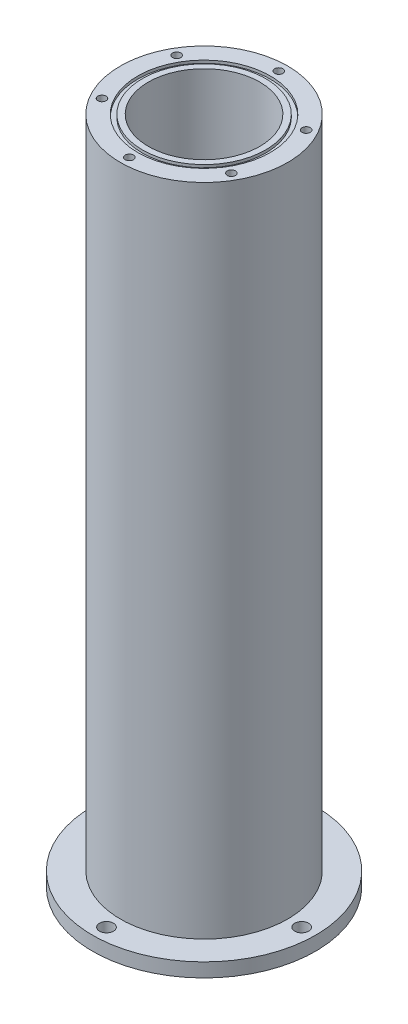
ISO-10303-21;
HEADER;
FILE_DESCRIPTION(('STEP AP214'),'2;1');
FILE_NAME('part.step','',(''),(''),'','','');
FILE_SCHEMA(('AUTOMOTIVE_DESIGN { 1 0 10303 214 1 1 1 1 }'));
ENDSEC;
DATA;
#1=APPLICATION_CONTEXT('core data for automotive mechanical design processes');
#2=APPLICATION_PROTOCOL_DEFINITION('international standard','automotive_design',2000,#1);
#3=PRODUCT_CONTEXT('',#1,'mechanical');
#4=PRODUCT('Part','Part','',(#3));
#5=PRODUCT_RELATED_PRODUCT_CATEGORY('part','',(#4));
#6=PRODUCT_DEFINITION_FORMATION('','',#4);
#7=PRODUCT_DEFINITION_CONTEXT('part definition',#1,'design');
#8=PRODUCT_DEFINITION('design','',#6,#7);
#9=PRODUCT_DEFINITION_SHAPE('','',#8);
#10=(LENGTH_UNIT() NAMED_UNIT(*) SI_UNIT(.MILLI.,.METRE.));
#11=(NAMED_UNIT(*) PLANE_ANGLE_UNIT() SI_UNIT($,.RADIAN.));
#12=(NAMED_UNIT(*) SI_UNIT($,.STERADIAN.) SOLID_ANGLE_UNIT());
#13=UNCERTAINTY_MEASURE_WITH_UNIT(LENGTH_MEASURE(1.E-05),#10,'distance_accuracy_value','');
#14=(GEOMETRIC_REPRESENTATION_CONTEXT(3) GLOBAL_UNCERTAINTY_ASSIGNED_CONTEXT((#13)) GLOBAL_UNIT_ASSIGNED_CONTEXT((#10,
#11,#12)) REPRESENTATION_CONTEXT('',''));
#15=CARTESIAN_POINT('',(0.,0.,0.));
#16=DIRECTION('',(0.,0.,1.));
#17=DIRECTION('',(1.,0.,0.));
#18=AXIS2_PLACEMENT_3D('',#15,#16,#17);
#19=CARTESIAN_POINT('',(0.,304.8,0.));
#20=DIRECTION('',(0.,1.,0.));
#21=DIRECTION('',(0.,0.,1.));
#22=AXIS2_PLACEMENT_3D('',#19,#20,#21);
#23=PLANE('',#22);
#24=CARTESIAN_POINT('',(0.,304.8,0.));
#25=DIRECTION('',(0.,1.,0.));
#26=DIRECTION('',(0.,0.,1.));
#27=AXIS2_PLACEMENT_3D('',#24,#25,#26);
#28=CIRCLE('',#27,25.4);
#29=CARTESIAN_POINT('',(0.,304.8,-25.4));
#30=VERTEX_POINT('',#29);
#31=EDGE_CURVE('E49',#30,#30,#28,.T.);
#32=ORIENTED_EDGE('',*,*,#31,.F.);
#33=EDGE_LOOP('',(#32));
#34=FACE_BOUND('',#33,.T.);
#35=CARTESIAN_POINT('',(0.,304.8,0.));
#36=DIRECTION('',(0.,1.,0.));
#37=DIRECTION('',(0.,0.,1.));
#38=AXIS2_PLACEMENT_3D('',#35,#36,#37);
#39=CIRCLE('',#38,28.1051);
#40=CARTESIAN_POINT('',(0.,304.8,28.1051));
#41=VERTEX_POINT('',#40);
#42=EDGE_CURVE('E97',#41,#41,#39,.T.);
#43=ORIENTED_EDGE('',*,*,#42,.T.);
#44=EDGE_LOOP('',(#43));
#45=FACE_BOUND('',#44,.T.);
#46=ADVANCED_FACE('F37',(#34,#45),#23,.T.);
#47=CARTESIAN_POINT('',(0.,304.8,0.));
#48=DIRECTION('',(0.,-1.,0.));
#49=DIRECTION('',(0.,0.,-1.));
#50=AXIS2_PLACEMENT_3D('',#47,#48,#49);
#51=CYLINDRICAL_SURFACE('',#50,25.4);
#52=CARTESIAN_POINT('',(0.,6.47700000000001,0.));
#53=DIRECTION('',(0.,-1.,0.));
#54=DIRECTION('',(0.,0.,-1.));
#55=AXIS2_PLACEMENT_3D('',#52,#53,#54);
#56=CIRCLE('',#55,25.4);
#57=CARTESIAN_POINT('',(0.,6.47700000000007,-25.4));
#58=VERTEX_POINT('',#57);
#59=EDGE_CURVE('E41',#58,#58,#56,.T.);
#60=CARTESIAN_POINT('',(0.,304.8,-25.4));
#61=CARTESIAN_POINT('',(0.,301.69246875,-25.4));
#62=CARTESIAN_POINT('',(0.,298.5849375,-25.4));
#63=CARTESIAN_POINT('',(0.,292.369875,-25.4));
#64=CARTESIAN_POINT('',(0.,289.26234375,-25.4));
#65=CARTESIAN_POINT('',(0.,283.04728125,-25.4));
#66=CARTESIAN_POINT('',(0.,279.93975,-25.4));
#67=CARTESIAN_POINT('',(0.,273.7246875,-25.4));
#68=CARTESIAN_POINT('',(0.,270.61715625,-25.4));
#69=CARTESIAN_POINT('',(0.,264.40209375,-25.4));
#70=CARTESIAN_POINT('',(0.,261.2945625,-25.4));
#71=CARTESIAN_POINT('',(0.,255.0795,-25.4));
#72=CARTESIAN_POINT('',(0.,251.97196875,-25.4));
#73=CARTESIAN_POINT('',(0.,245.75690625,-25.4));
#74=CARTESIAN_POINT('',(0.,242.649375,-25.4));
#75=CARTESIAN_POINT('',(0.,236.4343125,-25.4));
#76=CARTESIAN_POINT('',(0.,233.32678125,-25.4));
#77=CARTESIAN_POINT('',(0.,227.11171875,-25.4));
#78=CARTESIAN_POINT('',(0.,224.0041875,-25.4));
#79=CARTESIAN_POINT('',(0.,217.789125,-25.4));
#80=CARTESIAN_POINT('',(0.,214.68159375,-25.4));
#81=CARTESIAN_POINT('',(0.,208.46653125,-25.4));
#82=CARTESIAN_POINT('',(0.,205.359,-25.4));
#83=CARTESIAN_POINT('',(0.,199.1439375,-25.4));
#84=CARTESIAN_POINT('',(0.,196.03640625,-25.4));
#85=CARTESIAN_POINT('',(0.,189.82134375,-25.4));
#86=CARTESIAN_POINT('',(0.,186.7138125,-25.4));
#87=CARTESIAN_POINT('',(0.,180.49875,-25.4));
#88=CARTESIAN_POINT('',(0.,177.39121875,-25.4));
#89=CARTESIAN_POINT('',(0.,171.17615625,-25.4));
#90=CARTESIAN_POINT('',(0.,168.068625,-25.4));
#91=CARTESIAN_POINT('',(0.,161.8535625,-25.4));
#92=CARTESIAN_POINT('',(0.,158.74603125,-25.4));
#93=CARTESIAN_POINT('',(0.,152.53096875,-25.4));
#94=CARTESIAN_POINT('',(0.,149.4234375,-25.4));
#95=CARTESIAN_POINT('',(0.,143.208375,-25.4));
#96=CARTESIAN_POINT('',(0.,140.10084375,-25.4));
#97=CARTESIAN_POINT('',(0.,133.88578125,-25.4));
#98=CARTESIAN_POINT('',(0.,130.77825,-25.4));
#99=CARTESIAN_POINT('',(0.,124.5631875,-25.4));
#100=CARTESIAN_POINT('',(0.,121.45565625,-25.4));
#101=CARTESIAN_POINT('',(0.,115.24059375,-25.4));
#102=CARTESIAN_POINT('',(0.,112.1330625,-25.4));
#103=CARTESIAN_POINT('',(0.,105.918,-25.4));
#104=CARTESIAN_POINT('',(0.,102.81046875,-25.4));
#105=CARTESIAN_POINT('',(0.,96.5954062500001,-25.4));
#106=CARTESIAN_POINT('',(0.,93.4878750000001,-25.4));
#107=CARTESIAN_POINT('',(0.,87.2728125000001,-25.4));
#108=CARTESIAN_POINT('',(0.,84.16528125,-25.4));
#109=CARTESIAN_POINT('',(0.,77.95021875,-25.4));
#110=CARTESIAN_POINT('',(0.,74.8426875,-25.4));
#111=CARTESIAN_POINT('',(0.,68.627625,-25.4));
#112=CARTESIAN_POINT('',(0.,65.52009375,-25.4));
#113=CARTESIAN_POINT('',(0.,59.30503125,-25.4));
#114=CARTESIAN_POINT('',(0.,56.1975,-25.4));
#115=CARTESIAN_POINT('',(0.,49.9824375000001,-25.4));
#116=CARTESIAN_POINT('',(0.,46.8749062500001,-25.4));
#117=CARTESIAN_POINT('',(0.,40.6598437500001,-25.4));
#118=CARTESIAN_POINT('',(0.,37.5523125000001,-25.4));
#119=CARTESIAN_POINT('',(0.,31.3372500000001,-25.4));
#120=CARTESIAN_POINT('',(0.,28.2297187500001,-25.4));
#121=CARTESIAN_POINT('',(0.,22.0146562500001,-25.4));
#122=CARTESIAN_POINT('',(0.,18.9071250000001,-25.4));
#123=CARTESIAN_POINT('',(0.,12.6920625000001,-25.4));
#124=CARTESIAN_POINT('',(0.,9.58453125000006,-25.4));
#125=CARTESIAN_POINT('',(0.,6.47700000000007,-25.4));
#126=B_SPLINE_CURVE_WITH_KNOTS('',3,(#60,#61,#62,#63,#64,#65,#66,#67,#68,#69,#70,#71,#72,#73,
#74,#75,#76,#77,#78,#79,#80,#81,#82,#83,#84,#85,#86,#87,#88,#89,#90,#91,#92,#93,#94,#95,#96,#97,
#98,#99,#100,#101,#102,#103,#104,#105,#106,#107,#108,#109,#110,#111,#112,#113,#114,#115,#116,
#117,#118,#119,#120,#121,#122,#123,#124,#125),.UNSPECIFIED.,.F.,.F.,(4,2,2,2,2,2,2,2,2,2,2,2,2,
2,2,2,2,2,2,2,2,2,2,2,2,2,2,2,2,2,2,2,4),(0.,9.32259375,18.6451875,27.96778125,37.290375,
46.61296875,55.9355625,65.2581562499999,74.58075,83.9033437499999,93.2259374999999,102.54853125,
111.871125,121.19371875,130.5163125,139.83890625,149.1615,158.48409375,167.8066875,177.12928125,
186.451875,195.77446875,205.0970625,214.41965625,223.74225,233.06484375,242.3874375,
251.71003125,261.032625,270.35521875,279.6778125,289.00040625,298.323),.UNSPECIFIED.);
#127=EDGE_CURVE('BSEAM162',#30,#58,#126,.T.);
#128=ORIENTED_EDGE('',*,*,#31,.T.);
#129=ORIENTED_EDGE('',*,*,#59,.T.);
#130=ORIENTED_EDGE('',*,*,#127,.T.);
#131=ORIENTED_EDGE('',*,*,#127,.F.);
#132=EDGE_LOOP('',(#128,#130,#129,#131));
#133=FACE_BOUND('',#132,.T.);
#134=ADVANCED_FACE('F162',(#133),#51,.F.);
#135=CARTESIAN_POINT('',(0.,304.8,0.));
#136=DIRECTION('',(0.,-1.,0.));
#137=DIRECTION('',(0.,0.,-1.));
#138=AXIS2_PLACEMENT_3D('',#135,#136,#137);
#139=CYLINDRICAL_SURFACE('',#138,38.1);
#140=CARTESIAN_POINT('',(0.,304.8,0.));
#141=DIRECTION('',(0.,1.,0.));
#142=DIRECTION('',(0.,0.,1.));
#143=AXIS2_PLACEMENT_3D('',#140,#141,#142);
#144=CIRCLE('',#143,38.1);
#145=CARTESIAN_POINT('',(0.,304.8,-38.1));
#146=VERTEX_POINT('',#145);
#147=EDGE_CURVE('E45',#146,#146,#144,.T.);
#148=CARTESIAN_POINT('',(0.,6.35000000000002,0.));
#149=DIRECTION('',(0.,-1.,0.));
#150=DIRECTION('',(0.,0.,-1.));
#151=AXIS2_PLACEMENT_3D('',#148,#149,#150);
#152=CIRCLE('',#151,38.1);
#153=CARTESIAN_POINT('',(0.,6.35000000000008,-38.1));
#154=VERTEX_POINT('',#153);
#155=EDGE_CURVE('E10',#154,#154,#152,.T.);
#156=CARTESIAN_POINT('',(0.,304.8,-38.1));
#157=CARTESIAN_POINT('',(0.,301.691145833333,-38.1));
#158=CARTESIAN_POINT('',(0.,298.582291666667,-38.1));
#159=CARTESIAN_POINT('',(0.,292.364583333333,-38.1));
#160=CARTESIAN_POINT('',(0.,289.255729166667,-38.1));
#161=CARTESIAN_POINT('',(0.,283.038020833333,-38.1));
#162=CARTESIAN_POINT('',(0.,279.929166666667,-38.1));
#163=CARTESIAN_POINT('',(0.,273.711458333333,-38.1));
#164=CARTESIAN_POINT('',(0.,270.602604166667,-38.1));
#165=CARTESIAN_POINT('',(0.,264.384895833333,-38.1));
#166=CARTESIAN_POINT('',(0.,261.276041666667,-38.1));
#167=CARTESIAN_POINT('',(0.,255.058333333333,-38.1));
#168=CARTESIAN_POINT('',(0.,251.949479166667,-38.1));
#169=CARTESIAN_POINT('',(0.,245.731770833333,-38.1));
#170=CARTESIAN_POINT('',(0.,242.622916666667,-38.1));
#171=CARTESIAN_POINT('',(0.,236.405208333333,-38.1));
#172=CARTESIAN_POINT('',(0.,233.296354166667,-38.1));
#173=CARTESIAN_POINT('',(0.,227.078645833333,-38.1));
#174=CARTESIAN_POINT('',(0.,223.969791666667,-38.1));
#175=CARTESIAN_POINT('',(0.,217.752083333333,-38.1));
#176=CARTESIAN_POINT('',(0.,214.643229166667,-38.1));
#177=CARTESIAN_POINT('',(0.,208.425520833333,-38.1));
#178=CARTESIAN_POINT('',(0.,205.316666666667,-38.1));
#179=CARTESIAN_POINT('',(0.,199.098958333333,-38.1));
#180=CARTESIAN_POINT('',(0.,195.990104166667,-38.1));
#181=CARTESIAN_POINT('',(0.,189.772395833333,-38.1));
#182=CARTESIAN_POINT('',(0.,186.663541666667,-38.1));
#183=CARTESIAN_POINT('',(0.,180.445833333333,-38.1));
#184=CARTESIAN_POINT('',(0.,177.336979166667,-38.1));
#185=CARTESIAN_POINT('',(0.,171.119270833333,-38.1));
#186=CARTESIAN_POINT('',(0.,168.010416666667,-38.1));
#187=CARTESIAN_POINT('',(0.,161.792708333333,-38.1));
#188=CARTESIAN_POINT('',(0.,158.683854166667,-38.1));
#189=CARTESIAN_POINT('',(0.,152.466145833333,-38.1));
#190=CARTESIAN_POINT('',(0.,149.357291666667,-38.1));
#191=CARTESIAN_POINT('',(0.,143.139583333333,-38.1));
#192=CARTESIAN_POINT('',(0.,140.030729166667,-38.1));
#193=CARTESIAN_POINT('',(0.,133.813020833333,-38.1));
#194=CARTESIAN_POINT('',(0.,130.704166666667,-38.1));
#195=CARTESIAN_POINT('',(0.,124.486458333333,-38.1));
#196=CARTESIAN_POINT('',(0.,121.377604166667,-38.1));
#197=CARTESIAN_POINT('',(0.,115.159895833333,-38.1));
#198=CARTESIAN_POINT('',(0.,112.051041666667,-38.1));
#199=CARTESIAN_POINT('',(0.,105.833333333333,-38.1));
#200=CARTESIAN_POINT('',(0.,102.724479166667,-38.1));
#201=CARTESIAN_POINT('',(0.,96.5067708333333,-38.1));
#202=CARTESIAN_POINT('',(0.,93.3979166666667,-38.1));
#203=CARTESIAN_POINT('',(0.,87.1802083333334,-38.1));
#204=CARTESIAN_POINT('',(0.,84.0713541666667,-38.1));
#205=CARTESIAN_POINT('',(0.,77.8536458333334,-38.1));
#206=CARTESIAN_POINT('',(0.,74.7447916666667,-38.1));
#207=CARTESIAN_POINT('',(0.,68.5270833333334,-38.1));
#208=CARTESIAN_POINT('',(0.,65.4182291666667,-38.1));
#209=CARTESIAN_POINT('',(0.,59.2005208333334,-38.1));
#210=CARTESIAN_POINT('',(0.,56.0916666666667,-38.1));
#211=CARTESIAN_POINT('',(0.,49.8739583333334,-38.1));
#212=CARTESIAN_POINT('',(0.,46.7651041666667,-38.1));
#213=CARTESIAN_POINT('',(0.,40.5473958333334,-38.1));
#214=CARTESIAN_POINT('',(0.,37.4385416666668,-38.1));
#215=CARTESIAN_POINT('',(0.,31.2208333333334,-38.1));
#216=CARTESIAN_POINT('',(0.,28.1119791666667,-38.1));
#217=CARTESIAN_POINT('',(0.,21.8942708333334,-38.1));
#218=CARTESIAN_POINT('',(0.,18.7854166666668,-38.1));
#219=CARTESIAN_POINT('',(0.,12.5677083333334,-38.1));
#220=CARTESIAN_POINT('',(0.,9.45885416666675,-38.1));
#221=CARTESIAN_POINT('',(0.,6.35000000000008,-38.1));
#222=B_SPLINE_CURVE_WITH_KNOTS('',3,(#156,#157,#158,#159,#160,#161,#162,#163,#164,#165,#166,
#167,#168,#169,#170,#171,#172,#173,#174,#175,#176,#177,#178,#179,#180,#181,#182,#183,#184,#185,
#186,#187,#188,#189,#190,#191,#192,#193,#194,#195,#196,#197,#198,#199,#200,#201,#202,#203,#204,
#205,#206,#207,#208,#209,#210,#211,#212,#213,#214,#215,#216,#217,#218,#219,#220,#221),
.UNSPECIFIED.,.F.,.F.,(4,2,2,2,2,2,2,2,2,2,2,2,2,2,2,2,2,2,2,2,2,2,2,2,2,2,2,2,2,2,2,2,4),(0.,
9.32656250000002,18.653125,27.9796875,37.30625,46.6328125,55.959375,65.2859375,74.6125,
83.9390625,93.265625,102.5921875,111.91875,121.2453125,130.571875,139.8984375,149.225,
158.5515625,167.878125,177.2046875,186.53125,195.8578125,205.184375,214.5109375,223.8375,
233.1640625,242.490625,251.8171875,261.14375,270.4703125,279.796875,289.1234375,298.45),.UNSPECIFIED.);
#223=EDGE_CURVE('BSEAM39',#146,#154,#222,.T.);
#224=ORIENTED_EDGE('',*,*,#147,.F.);
#225=ORIENTED_EDGE('',*,*,#155,.F.);
#226=ORIENTED_EDGE('',*,*,#223,.T.);
#227=ORIENTED_EDGE('',*,*,#223,.F.);
#228=EDGE_LOOP('',(#224,#226,#225,#227));
#229=FACE_BOUND('',#228,.T.);
#230=ADVANCED_FACE('F39',(#229),#139,.T.);
#231=CARTESIAN_POINT('',(29.476040643207,304.8,-17.0180000000003));
#232=DIRECTION('',(0.,1.,0.));
#233=DIRECTION('',(0.,0.,1.));
#234=AXIS2_PLACEMENT_3D('',#231,#232,#233);
#235=CIRCLE('',#234,1.8669);
#236=CARTESIAN_POINT('',(29.476040643207,304.8,-15.1511000000003));
#237=VERTEX_POINT('',#236);
#238=EDGE_CURVE('E135',#237,#237,#235,.T.);
#239=ORIENTED_EDGE('',*,*,#238,.F.);
#240=EDGE_LOOP('',(#239));
#241=FACE_BOUND('',#240,.T.);
#242=CARTESIAN_POINT('',(29.4760406432073,304.8,17.0179999999997));
#243=DIRECTION('',(0.,1.,0.));
#244=DIRECTION('',(0.,0.,1.));
#245=AXIS2_PLACEMENT_3D('',#242,#243,#244);
#246=CIRCLE('',#245,1.8669);
#247=CARTESIAN_POINT('',(29.4760406432073,304.8,18.8848999999997));
#248=VERTEX_POINT('',#247);
#249=EDGE_CURVE('E129',#248,#248,#246,.T.);
#250=ORIENTED_EDGE('',*,*,#249,.F.);
#251=EDGE_LOOP('',(#250));
#252=FACE_BOUND('',#251,.T.);
#253=CARTESIAN_POINT('',(0.,304.8,34.036));
#254=DIRECTION('',(0.,1.,0.));
#255=DIRECTION('',(0.,0.,1.));
#256=AXIS2_PLACEMENT_3D('',#253,#254,#255);
#257=CIRCLE('',#256,1.8669);
#258=CARTESIAN_POINT('',(0.,304.8,35.9029));
#259=VERTEX_POINT('',#258);
#260=EDGE_CURVE('E123',#259,#259,#257,.T.);
#261=ORIENTED_EDGE('',*,*,#260,.F.);
#262=EDGE_LOOP('',(#261));
#263=FACE_BOUND('',#262,.T.);
#264=CARTESIAN_POINT('',(-29.4760406432071,304.8,17.0180000000001));
#265=DIRECTION('',(0.,1.,0.));
#266=DIRECTION('',(0.,0.,1.));
#267=AXIS2_PLACEMENT_3D('',#264,#265,#266);
#268=CIRCLE('',#267,1.8669);
#269=CARTESIAN_POINT('',(-29.4760406432071,304.8,18.8849000000001));
#270=VERTEX_POINT('',#269);
#271=EDGE_CURVE('E117',#270,#270,#268,.T.);
#272=ORIENTED_EDGE('',*,*,#271,.F.);
#273=EDGE_LOOP('',(#272));
#274=FACE_BOUND('',#273,.T.);
#275=CARTESIAN_POINT('',(-29.4760406432072,304.8,-17.0179999999999));
#276=DIRECTION('',(0.,1.,0.));
#277=DIRECTION('',(0.,0.,1.));
#278=AXIS2_PLACEMENT_3D('',#275,#276,#277);
#279=CIRCLE('',#278,1.8669);
#280=CARTESIAN_POINT('',(-29.4760406432072,304.8,-15.1510999999999));
#281=VERTEX_POINT('',#280);
#282=EDGE_CURVE('E111',#281,#281,#279,.T.);
#283=ORIENTED_EDGE('',*,*,#282,.F.);
#284=EDGE_LOOP('',(#283));
#285=FACE_BOUND('',#284,.T.);
#286=CARTESIAN_POINT('',(0.,304.8,-34.036));
#287=DIRECTION('',(0.,1.,0.));
#288=DIRECTION('',(0.,0.,1.));
#289=AXIS2_PLACEMENT_3D('',#286,#287,#288);
#290=CIRCLE('',#289,1.8669);
#291=CARTESIAN_POINT('',(0.,304.8,-32.1691));
#292=VERTEX_POINT('',#291);
#293=EDGE_CURVE('E105',#292,#292,#290,.T.);
#294=ORIENTED_EDGE('',*,*,#293,.F.);
#295=EDGE_LOOP('',(#294));
#296=FACE_BOUND('',#295,.T.);
#297=CARTESIAN_POINT('',(0.,304.8,0.));
#298=DIRECTION('',(0.,1.,0.));
#299=DIRECTION('',(0.,0.,1.));
#300=AXIS2_PLACEMENT_3D('',#297,#298,#299);
#301=CIRCLE('',#300,30.2133);
#302=CARTESIAN_POINT('',(0.,304.8,30.2133));
#303=VERTEX_POINT('',#302);
#304=EDGE_CURVE('E91',#303,#303,#301,.T.);
#305=ORIENTED_EDGE('',*,*,#304,.F.);
#306=EDGE_LOOP('',(#305));
#307=FACE_BOUND('',#306,.T.);
#308=ORIENTED_EDGE('',*,*,#147,.T.);
#309=EDGE_LOOP('',(#308));
#310=FACE_BOUND('',#309,.T.);
#311=ADVANCED_FACE('F141',(#241,#252,#263,#274,#285,#296,#307,#310),#23,.T.);
#312=CARTESIAN_POINT('',(0.,0.,0.));
#313=DIRECTION('',(0.,1.,0.));
#314=DIRECTION('',(0.,0.,1.));
#315=AXIS2_PLACEMENT_3D('',#312,#313,#314);
#316=PLANE('',#315);
#317=CARTESIAN_POINT('',(29.476040643207,0.,-17.0180000000003));
#318=DIRECTION('',(0.,1.,0.));
#319=DIRECTION('',(0.,0.,1.));
#320=AXIS2_PLACEMENT_3D('',#317,#318,#319);
#321=CIRCLE('',#320,1.86689999999996);
#322=CARTESIAN_POINT('',(29.476040643207,0.,-15.1511000000004));
#323=VERTEX_POINT('',#322);
#324=EDGE_CURVE('E132',#323,#323,#321,.T.);
#325=ORIENTED_EDGE('',*,*,#324,.T.);
#326=EDGE_LOOP('',(#325));
#327=FACE_BOUND('',#326,.T.);
#328=CARTESIAN_POINT('',(29.4760406432073,0.,17.0179999999997));
#329=DIRECTION('',(0.,1.,0.));
#330=DIRECTION('',(0.,0.,1.));
#331=AXIS2_PLACEMENT_3D('',#328,#329,#330);
#332=CIRCLE('',#331,1.86689999999996);
#333=CARTESIAN_POINT('',(29.4760406432073,0.,18.8848999999997));
#334=VERTEX_POINT('',#333);
#335=EDGE_CURVE('E126',#334,#334,#332,.T.);
#336=ORIENTED_EDGE('',*,*,#335,.T.);
#337=EDGE_LOOP('',(#336));
#338=FACE_BOUND('',#337,.T.);
#339=CARTESIAN_POINT('',(0.,0.,34.036));
#340=DIRECTION('',(0.,1.,0.));
#341=DIRECTION('',(0.,0.,1.));
#342=AXIS2_PLACEMENT_3D('',#339,#340,#341);
#343=CIRCLE('',#342,1.86689999999996);
#344=CARTESIAN_POINT('',(0.,0.,35.9029));
#345=VERTEX_POINT('',#344);
#346=EDGE_CURVE('E120',#345,#345,#343,.T.);
#347=ORIENTED_EDGE('',*,*,#346,.T.);
#348=EDGE_LOOP('',(#347));
#349=FACE_BOUND('',#348,.T.);
#350=CARTESIAN_POINT('',(-29.4760406432071,0.,17.0180000000001));
#351=DIRECTION('',(0.,1.,0.));
#352=DIRECTION('',(0.,0.,1.));
#353=AXIS2_PLACEMENT_3D('',#350,#351,#352);
#354=CIRCLE('',#353,1.86689999999996);
#355=CARTESIAN_POINT('',(-29.4760406432071,0.,18.8849000000001));
#356=VERTEX_POINT('',#355);
#357=EDGE_CURVE('E114',#356,#356,#354,.T.);
#358=ORIENTED_EDGE('',*,*,#357,.T.);
#359=EDGE_LOOP('',(#358));
#360=FACE_BOUND('',#359,.T.);
#361=CARTESIAN_POINT('',(-29.4760406432072,0.,-17.0179999999999));
#362=DIRECTION('',(0.,1.,0.));
#363=DIRECTION('',(0.,0.,1.));
#364=AXIS2_PLACEMENT_3D('',#361,#362,#363);
#365=CIRCLE('',#364,1.86689999999996);
#366=CARTESIAN_POINT('',(-29.4760406432072,0.,-15.1511));
#367=VERTEX_POINT('',#366);
#368=EDGE_CURVE('E108',#367,#367,#365,.T.);
#369=ORIENTED_EDGE('',*,*,#368,.T.);
#370=EDGE_LOOP('',(#369));
#371=FACE_BOUND('',#370,.T.);
#372=CARTESIAN_POINT('',(0.,0.,-34.036));
#373=DIRECTION('',(0.,1.,0.));
#374=DIRECTION('',(0.,0.,1.));
#375=AXIS2_PLACEMENT_3D('',#372,#373,#374);
#376=CIRCLE('',#375,1.86689999999996);
#377=CARTESIAN_POINT('',(0.,0.,-32.1691));
#378=VERTEX_POINT('',#377);
#379=EDGE_CURVE('E100',#378,#378,#376,.T.);
#380=ORIENTED_EDGE('',*,*,#379,.T.);
#381=EDGE_LOOP('',(#380));
#382=FACE_BOUND('',#381,.T.);
#383=CARTESIAN_POINT('',(0.,0.,0.));
#384=DIRECTION('',(0.,-1.,0.));
#385=DIRECTION('',(0.,0.,-1.));
#386=AXIS2_PLACEMENT_3D('',#383,#384,#385);
#387=CIRCLE('',#386,28.6385);
#388=CARTESIAN_POINT('',(0.,0.,-28.6385));
#389=VERTEX_POINT('',#388);
#390=EDGE_CURVE('E84',#389,#389,#387,.T.);
#391=ORIENTED_EDGE('',*,*,#390,.F.);
#392=EDGE_LOOP('',(#391));
#393=FACE_BOUND('',#392,.T.);
#394=CARTESIAN_POINT('',(0.,0.,44.45));
#395=DIRECTION('',(0.,-1.,0.));
#396=DIRECTION('',(0.,0.,-1.));
#397=AXIS2_PLACEMENT_3D('',#394,#395,#396);
#398=CIRCLE('',#397,3.175);
#399=CARTESIAN_POINT('',(0.,0.,41.275));
#400=VERTEX_POINT('',#399);
#401=EDGE_CURVE('E81',#400,#400,#398,.T.);
#402=ORIENTED_EDGE('',*,*,#401,.F.);
#403=EDGE_LOOP('',(#402));
#404=FACE_BOUND('',#403,.T.);
#405=CARTESIAN_POINT('',(44.45,0.,0.));
#406=DIRECTION('',(0.,-1.,0.));
#407=DIRECTION('',(0.,0.,-1.));
#408=AXIS2_PLACEMENT_3D('',#405,#406,#407);
#409=CIRCLE('',#408,3.175);
#410=CARTESIAN_POINT('',(44.45,0.,-3.175));
#411=VERTEX_POINT('',#410);
#412=EDGE_CURVE('E75',#411,#411,#409,.T.);
#413=ORIENTED_EDGE('',*,*,#412,.F.);
#414=EDGE_LOOP('',(#413));
#415=FACE_BOUND('',#414,.T.);
#416=CARTESIAN_POINT('',(0.,0.,-44.45));
#417=DIRECTION('',(0.,-1.,0.));
#418=DIRECTION('',(0.,0.,-1.));
#419=AXIS2_PLACEMENT_3D('',#416,#417,#418);
#420=CIRCLE('',#419,3.175);
#421=CARTESIAN_POINT('',(0.,0.,-47.625));
#422=VERTEX_POINT('',#421);
#423=EDGE_CURVE('E69',#422,#422,#420,.T.);
#424=ORIENTED_EDGE('',*,*,#423,.F.);
#425=EDGE_LOOP('',(#424));
#426=FACE_BOUND('',#425,.T.);
#427=CARTESIAN_POINT('',(-44.45,0.,0.));
#428=DIRECTION('',(0.,-1.,0.));
#429=DIRECTION('',(0.,0.,-1.));
#430=AXIS2_PLACEMENT_3D('',#427,#428,#429);
#431=CIRCLE('',#430,3.175);
#432=CARTESIAN_POINT('',(-44.45,0.,-3.175));
#433=VERTEX_POINT('',#432);
#434=EDGE_CURVE('E63',#433,#433,#431,.T.);
#435=ORIENTED_EDGE('',*,*,#434,.F.);
#436=EDGE_LOOP('',(#435));
#437=FACE_BOUND('',#436,.T.);
#438=CARTESIAN_POINT('',(0.,0.,0.));
#439=DIRECTION('',(0.,-1.,0.));
#440=DIRECTION('',(0.,0.,-1.));
#441=AXIS2_PLACEMENT_3D('',#438,#439,#440);
#442=CIRCLE('',#441,50.8);
#443=CARTESIAN_POINT('',(0.,0.,-50.8));
#444=VERTEX_POINT('',#443);
#445=EDGE_CURVE('E55',#444,#444,#442,.T.);
#446=ORIENTED_EDGE('',*,*,#445,.T.);
#447=EDGE_LOOP('',(#446));
#448=FACE_BOUND('',#447,.T.);
#449=ADVANCED_FACE('F144',(#327,#338,#349,#360,#371,#382,#393,#404,#415,#426,#437,#448),#316,.F.);
#450=CARTESIAN_POINT('',(0.,6.35,0.));
#451=DIRECTION('',(0.,-1.,0.));
#452=DIRECTION('',(0.,0.,-1.));
#453=AXIS2_PLACEMENT_3D('',#450,#451,#452);
#454=CYLINDRICAL_SURFACE('',#453,50.8);
#455=CARTESIAN_POINT('',(0.,6.35,0.));
#456=DIRECTION('',(0.,-1.,0.));
#457=DIRECTION('',(0.,0.,-1.));
#458=AXIS2_PLACEMENT_3D('',#455,#456,#457);
#459=CIRCLE('',#458,50.8);
#460=CARTESIAN_POINT('',(0.,6.35,-50.8));
#461=VERTEX_POINT('',#460);
#462=EDGE_CURVE('E54',#461,#461,#459,.T.);
#463=ORIENTED_EDGE('',*,*,#462,.T.);
#464=EDGE_LOOP('',(#463));
#465=FACE_BOUND('',#464,.T.);
#466=ORIENTED_EDGE('',*,*,#445,.F.);
#467=EDGE_LOOP('',(#466));
#468=FACE_BOUND('',#467,.T.);
#469=ADVANCED_FACE('F176',(#465,#468),#454,.T.);
#470=CARTESIAN_POINT('',(0.,6.35,0.));
#471=DIRECTION('',(0.,-1.,0.));
#472=DIRECTION('',(0.,0.,-1.));
#473=AXIS2_PLACEMENT_3D('',#470,#471,#472);
#474=PLANE('',#473);
#475=CARTESIAN_POINT('',(0.,6.35,44.45));
#476=DIRECTION('',(0.,-1.,0.));
#477=DIRECTION('',(0.,0.,-1.));
#478=AXIS2_PLACEMENT_3D('',#475,#476,#477);
#479=CIRCLE('',#478,3.175);
#480=CARTESIAN_POINT('',(0.,6.35,41.275));
#481=VERTEX_POINT('',#480);
#482=EDGE_CURVE('E78',#481,#481,#479,.T.);
#483=ORIENTED_EDGE('',*,*,#482,.T.);
#484=EDGE_LOOP('',(#483));
#485=FACE_BOUND('',#484,.T.);
#486=CARTESIAN_POINT('',(44.45,6.35,0.));
#487=DIRECTION('',(0.,-1.,0.));
#488=DIRECTION('',(0.,0.,-1.));
#489=AXIS2_PLACEMENT_3D('',#486,#487,#488);
#490=CIRCLE('',#489,3.175);
#491=CARTESIAN_POINT('',(44.45,6.35,-3.175));
#492=VERTEX_POINT('',#491);
#493=EDGE_CURVE('E72',#492,#492,#490,.T.);
#494=ORIENTED_EDGE('',*,*,#493,.T.);
#495=EDGE_LOOP('',(#494));
#496=FACE_BOUND('',#495,.T.);
#497=CARTESIAN_POINT('',(0.,6.35,-44.45));
#498=DIRECTION('',(0.,-1.,0.));
#499=DIRECTION('',(0.,0.,-1.));
#500=AXIS2_PLACEMENT_3D('',#497,#498,#499);
#501=CIRCLE('',#500,3.175);
#502=CARTESIAN_POINT('',(0.,6.35,-47.625));
#503=VERTEX_POINT('',#502);
#504=EDGE_CURVE('E66',#503,#503,#501,.T.);
#505=ORIENTED_EDGE('',*,*,#504,.T.);
#506=EDGE_LOOP('',(#505));
#507=FACE_BOUND('',#506,.T.);
#508=CARTESIAN_POINT('',(-44.45,6.35,0.));
#509=DIRECTION('',(0.,-1.,0.));
#510=DIRECTION('',(0.,0.,-1.));
#511=AXIS2_PLACEMENT_3D('',#508,#509,#510);
#512=CIRCLE('',#511,3.175);
#513=CARTESIAN_POINT('',(-44.45,6.35,-3.175));
#514=VERTEX_POINT('',#513);
#515=EDGE_CURVE('E58',#514,#514,#512,.T.);
#516=ORIENTED_EDGE('',*,*,#515,.T.);
#517=EDGE_LOOP('',(#516));
#518=FACE_BOUND('',#517,.T.);
#519=ORIENTED_EDGE('',*,*,#155,.T.);
#520=EDGE_LOOP('',(#519));
#521=FACE_BOUND('',#520,.T.);
#522=ORIENTED_EDGE('',*,*,#462,.F.);
#523=EDGE_LOOP('',(#522));
#524=FACE_BOUND('',#523,.T.);
#525=ADVANCED_FACE('F181',(#485,#496,#507,#518,#521,#524),#474,.F.);
#526=CARTESIAN_POINT('',(-44.45,0.,0.));
#527=DIRECTION('',(0.,-1.,0.));
#528=DIRECTION('',(0.,0.,-1.));
#529=AXIS2_PLACEMENT_3D('',#526,#527,#528);
#530=CYLINDRICAL_SURFACE('',#529,3.175);
#531=ORIENTED_EDGE('',*,*,#515,.F.);
#532=EDGE_LOOP('',(#531));
#533=FACE_BOUND('',#532,.T.);
#534=ORIENTED_EDGE('',*,*,#434,.T.);
#535=EDGE_LOOP('',(#534));
#536=FACE_BOUND('',#535,.T.);
#537=ADVANCED_FACE('F208',(#533,#536),#530,.F.);
#538=CARTESIAN_POINT('',(0.,0.,-44.45));
#539=DIRECTION('',(0.,-1.,0.));
#540=DIRECTION('',(0.,0.,-1.));
#541=AXIS2_PLACEMENT_3D('',#538,#539,#540);
#542=CYLINDRICAL_SURFACE('',#541,3.175);
#543=ORIENTED_EDGE('',*,*,#504,.F.);
#544=EDGE_LOOP('',(#543));
#545=FACE_BOUND('',#544,.T.);
#546=ORIENTED_EDGE('',*,*,#423,.T.);
#547=EDGE_LOOP('',(#546));
#548=FACE_BOUND('',#547,.T.);
#549=ADVANCED_FACE('F210',(#545,#548),#542,.F.);
#550=CARTESIAN_POINT('',(44.45,0.,0.));
#551=DIRECTION('',(0.,-1.,0.));
#552=DIRECTION('',(0.,0.,-1.));
#553=AXIS2_PLACEMENT_3D('',#550,#551,#552);
#554=CYLINDRICAL_SURFACE('',#553,3.175);
#555=ORIENTED_EDGE('',*,*,#493,.F.);
#556=EDGE_LOOP('',(#555));
#557=FACE_BOUND('',#556,.T.);
#558=ORIENTED_EDGE('',*,*,#412,.T.);
#559=EDGE_LOOP('',(#558));
#560=FACE_BOUND('',#559,.T.);
#561=ADVANCED_FACE('F217',(#557,#560),#554,.F.);
#562=CARTESIAN_POINT('',(0.,0.,44.45));
#563=DIRECTION('',(0.,-1.,0.));
#564=DIRECTION('',(0.,0.,-1.));
#565=AXIS2_PLACEMENT_3D('',#562,#563,#564);
#566=CYLINDRICAL_SURFACE('',#565,3.175);
#567=ORIENTED_EDGE('',*,*,#482,.F.);
#568=EDGE_LOOP('',(#567));
#569=FACE_BOUND('',#568,.T.);
#570=ORIENTED_EDGE('',*,*,#401,.T.);
#571=EDGE_LOOP('',(#570));
#572=FACE_BOUND('',#571,.T.);
#573=ADVANCED_FACE('F226',(#569,#572),#566,.F.);
#574=CARTESIAN_POINT('',(0.,6.477,0.));
#575=DIRECTION('',(0.,-1.,0.));
#576=DIRECTION('',(0.,0.,-1.));
#577=AXIS2_PLACEMENT_3D('',#574,#575,#576);
#578=CYLINDRICAL_SURFACE('',#577,28.6385);
#579=CARTESIAN_POINT('',(0.,6.477,0.));
#580=DIRECTION('',(0.,-1.,0.));
#581=DIRECTION('',(0.,0.,-1.));
#582=AXIS2_PLACEMENT_3D('',#579,#580,#581);
#583=CIRCLE('',#582,28.6385);
#584=CARTESIAN_POINT('',(0.,6.477,-28.6385));
#585=VERTEX_POINT('',#584);
#586=EDGE_CURVE('E87',#585,#585,#583,.T.);
#587=ORIENTED_EDGE('',*,*,#586,.F.);
#588=EDGE_LOOP('',(#587));
#589=FACE_BOUND('',#588,.T.);
#590=ORIENTED_EDGE('',*,*,#390,.T.);
#591=EDGE_LOOP('',(#590));
#592=FACE_BOUND('',#591,.T.);
#593=ADVANCED_FACE('F230',(#589,#592),#578,.F.);
#594=CARTESIAN_POINT('',(0.,6.477,0.));
#595=DIRECTION('',(0.,-1.,0.));
#596=DIRECTION('',(0.,0.,-1.));
#597=AXIS2_PLACEMENT_3D('',#594,#595,#596);
#598=PLANE('',#597);
#599=ORIENTED_EDGE('',*,*,#59,.F.);
#600=EDGE_LOOP('',(#599));
#601=FACE_BOUND('',#600,.T.);
#602=ORIENTED_EDGE('',*,*,#586,.T.);
#603=EDGE_LOOP('',(#602));
#604=FACE_BOUND('',#603,.T.);
#605=ADVANCED_FACE('F234',(#601,#604),#598,.T.);
#606=CARTESIAN_POINT('',(0.,303.53,0.));
#607=DIRECTION('',(0.,1.,0.));
#608=DIRECTION('',(0.,0.,1.));
#609=AXIS2_PLACEMENT_3D('',#606,#607,#608);
#610=CYLINDRICAL_SURFACE('',#609,30.2133);
#611=CARTESIAN_POINT('',(0.,303.53,0.));
#612=DIRECTION('',(0.,1.,0.));
#613=DIRECTION('',(0.,0.,1.));
#614=AXIS2_PLACEMENT_3D('',#611,#612,#613);
#615=CIRCLE('',#614,30.2133);
#616=CARTESIAN_POINT('',(0.,303.53,30.2133));
#617=VERTEX_POINT('',#616);
#618=EDGE_CURVE('E88',#617,#617,#615,.T.);
#619=ORIENTED_EDGE('',*,*,#618,.F.);
#620=EDGE_LOOP('',(#619));
#621=FACE_BOUND('',#620,.T.);
#622=ORIENTED_EDGE('',*,*,#304,.T.);
#623=EDGE_LOOP('',(#622));
#624=FACE_BOUND('',#623,.T.);
#625=ADVANCED_FACE('F238',(#621,#624),#610,.F.);
#626=CARTESIAN_POINT('',(0.,303.53,0.));
#627=DIRECTION('',(0.,1.,0.));
#628=DIRECTION('',(0.,0.,1.));
#629=AXIS2_PLACEMENT_3D('',#626,#627,#628);
#630=PLANE('',#629);
#631=CARTESIAN_POINT('',(0.,303.53,0.));
#632=DIRECTION('',(0.,1.,0.));
#633=DIRECTION('',(0.,0.,1.));
#634=AXIS2_PLACEMENT_3D('',#631,#632,#633);
#635=CIRCLE('',#634,28.1051);
#636=CARTESIAN_POINT('',(0.,303.53,28.1051));
#637=VERTEX_POINT('',#636);
#638=EDGE_CURVE('E94',#637,#637,#635,.T.);
#639=ORIENTED_EDGE('',*,*,#638,.F.);
#640=EDGE_LOOP('',(#639));
#641=FACE_BOUND('',#640,.T.);
#642=ORIENTED_EDGE('',*,*,#618,.T.);
#643=EDGE_LOOP('',(#642));
#644=FACE_BOUND('',#643,.T.);
#645=ADVANCED_FACE('F242',(#641,#644),#630,.T.);
#646=CARTESIAN_POINT('',(0.,303.53,0.));
#647=DIRECTION('',(0.,1.,0.));
#648=DIRECTION('',(0.,0.,1.));
#649=AXIS2_PLACEMENT_3D('',#646,#647,#648);
#650=CYLINDRICAL_SURFACE('',#649,28.1051);
#651=ORIENTED_EDGE('',*,*,#638,.T.);
#652=EDGE_LOOP('',(#651));
#653=FACE_BOUND('',#652,.T.);
#654=ORIENTED_EDGE('',*,*,#42,.F.);
#655=EDGE_LOOP('',(#654));
#656=FACE_BOUND('',#655,.T.);
#657=ADVANCED_FACE('F246',(#653,#656),#650,.T.);
#658=CARTESIAN_POINT('',(0.,304.8,-34.036));
#659=DIRECTION('',(0.,1.,0.));
#660=DIRECTION('',(0.,0.,1.));
#661=AXIS2_PLACEMENT_3D('',#658,#659,#660);
#662=CYLINDRICAL_SURFACE('',#661,1.86689999999996);
#663=ORIENTED_EDGE('',*,*,#379,.F.);
#664=EDGE_LOOP('',(#663));
#665=FACE_BOUND('',#664,.T.);
#666=ORIENTED_EDGE('',*,*,#293,.T.);
#667=EDGE_LOOP('',(#666));
#668=FACE_BOUND('',#667,.T.);
#669=ADVANCED_FACE('F250',(#665,#668),#662,.F.);
#670=CARTESIAN_POINT('',(-29.4760406432072,304.8,-17.0179999999999));
#671=DIRECTION('',(0.,1.,0.));
#672=DIRECTION('',(0.,0.,1.));
#673=AXIS2_PLACEMENT_3D('',#670,#671,#672);
#674=CYLINDRICAL_SURFACE('',#673,1.86689999999996);
#675=ORIENTED_EDGE('',*,*,#368,.F.);
#676=EDGE_LOOP('',(#675));
#677=FACE_BOUND('',#676,.T.);
#678=ORIENTED_EDGE('',*,*,#282,.T.);
#679=EDGE_LOOP('',(#678));
#680=FACE_BOUND('',#679,.T.);
#681=ADVANCED_FACE('F254',(#677,#680),#674,.F.);
#682=CARTESIAN_POINT('',(-29.4760406432071,304.8,17.0180000000001));
#683=DIRECTION('',(0.,1.,0.));
#684=DIRECTION('',(0.,0.,1.));
#685=AXIS2_PLACEMENT_3D('',#682,#683,#684);
#686=CYLINDRICAL_SURFACE('',#685,1.86689999999996);
#687=ORIENTED_EDGE('',*,*,#357,.F.);
#688=EDGE_LOOP('',(#687));
#689=FACE_BOUND('',#688,.T.);
#690=ORIENTED_EDGE('',*,*,#271,.T.);
#691=EDGE_LOOP('',(#690));
#692=FACE_BOUND('',#691,.T.);
#693=ADVANCED_FACE('F258',(#689,#692),#686,.F.);
#694=CARTESIAN_POINT('',(0.,304.8,34.036));
#695=DIRECTION('',(0.,1.,0.));
#696=DIRECTION('',(0.,0.,1.));
#697=AXIS2_PLACEMENT_3D('',#694,#695,#696);
#698=CYLINDRICAL_SURFACE('',#697,1.86689999999996);
#699=ORIENTED_EDGE('',*,*,#346,.F.);
#700=EDGE_LOOP('',(#699));
#701=FACE_BOUND('',#700,.T.);
#702=ORIENTED_EDGE('',*,*,#260,.T.);
#703=EDGE_LOOP('',(#702));
#704=FACE_BOUND('',#703,.T.);
#705=ADVANCED_FACE('F262',(#701,#704),#698,.F.);
#706=CARTESIAN_POINT('',(29.4760406432073,304.8,17.0179999999997));
#707=DIRECTION('',(0.,1.,0.));
#708=DIRECTION('',(0.,0.,1.));
#709=AXIS2_PLACEMENT_3D('',#706,#707,#708);
#710=CYLINDRICAL_SURFACE('',#709,1.86689999999996);
#711=ORIENTED_EDGE('',*,*,#335,.F.);
#712=EDGE_LOOP('',(#711));
#713=FACE_BOUND('',#712,.T.);
#714=ORIENTED_EDGE('',*,*,#249,.T.);
#715=EDGE_LOOP('',(#714));
#716=FACE_BOUND('',#715,.T.);
#717=ADVANCED_FACE('F266',(#713,#716),#710,.F.);
#718=CARTESIAN_POINT('',(29.476040643207,304.8,-17.0180000000003));
#719=DIRECTION('',(0.,1.,0.));
#720=DIRECTION('',(0.,0.,1.));
#721=AXIS2_PLACEMENT_3D('',#718,#719,#720);
#722=CYLINDRICAL_SURFACE('',#721,1.86689999999996);
#723=ORIENTED_EDGE('',*,*,#324,.F.);
#724=EDGE_LOOP('',(#723));
#725=FACE_BOUND('',#724,.T.);
#726=ORIENTED_EDGE('',*,*,#238,.T.);
#727=EDGE_LOOP('',(#726));
#728=FACE_BOUND('',#727,.T.);
#729=ADVANCED_FACE('F139',(#725,#728),#722,.F.);
#730=CLOSED_SHELL('',(#46,#134,#230,#311,#449,#469,#525,#537,#549,#561,#573,#593,#605,#625,#645,
#657,#669,#681,#693,#705,#717,#729));
#731=MANIFOLD_SOLID_BREP('B2',#730);
#732=ADVANCED_BREP_SHAPE_REPRESENTATION('',(#18,#731),#14);
#733=SHAPE_DEFINITION_REPRESENTATION(#9,#732);
ENDSEC;
END-ISO-10303-21;
